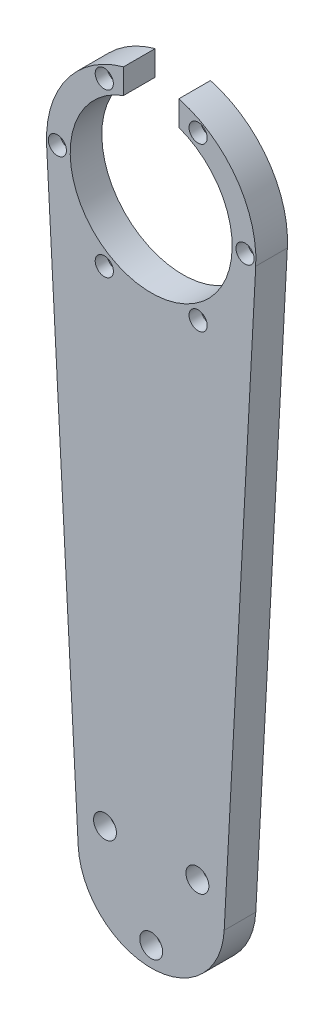
ISO-10303-21;
HEADER;
FILE_DESCRIPTION(('STEP AP214'),'2;1');
FILE_NAME('part.step','',(''),(''),'','','');
FILE_SCHEMA(('AUTOMOTIVE_DESIGN { 1 0 10303 214 1 1 1 1 }'));
ENDSEC;
DATA;
#1=APPLICATION_CONTEXT('core data for automotive mechanical design processes');
#2=APPLICATION_PROTOCOL_DEFINITION('international standard','automotive_design',2000,#1);
#3=PRODUCT_CONTEXT('',#1,'mechanical');
#4=PRODUCT('Part','Part','',(#3));
#5=PRODUCT_RELATED_PRODUCT_CATEGORY('part','',(#4));
#6=PRODUCT_DEFINITION_FORMATION('','',#4);
#7=PRODUCT_DEFINITION_CONTEXT('part definition',#1,'design');
#8=PRODUCT_DEFINITION('design','',#6,#7);
#9=PRODUCT_DEFINITION_SHAPE('','',#8);
#10=(LENGTH_UNIT() NAMED_UNIT(*) SI_UNIT(.MILLI.,.METRE.));
#11=(NAMED_UNIT(*) PLANE_ANGLE_UNIT() SI_UNIT($,.RADIAN.));
#12=(NAMED_UNIT(*) SI_UNIT($,.STERADIAN.) SOLID_ANGLE_UNIT());
#13=UNCERTAINTY_MEASURE_WITH_UNIT(LENGTH_MEASURE(1.E-05),#10,'distance_accuracy_value','');
#14=(GEOMETRIC_REPRESENTATION_CONTEXT(3) GLOBAL_UNCERTAINTY_ASSIGNED_CONTEXT((#13)) GLOBAL_UNIT_ASSIGNED_CONTEXT((#10,
#11,#12)) REPRESENTATION_CONTEXT('',''));
#15=CARTESIAN_POINT('',(0.,0.,0.));
#16=DIRECTION('',(0.,0.,1.));
#17=DIRECTION('',(1.,0.,0.));
#18=AXIS2_PLACEMENT_3D('',#15,#16,#17);
#19=CARTESIAN_POINT('',(11.8749999999999,129.43189666012,-2.));
#20=DIRECTION('',(0.,0.,1.));
#21=DIRECTION('',(1.,0.,0.));
#22=AXIS2_PLACEMENT_3D('',#19,#20,#21);
#23=CYLINDRICAL_SURFACE('',#22,1.25);
#24=CARTESIAN_POINT('',(11.8749999999999,129.43189666012,0.));
#25=DIRECTION('',(0.,0.,1.));
#26=DIRECTION('',(1.,0.,0.));
#27=AXIS2_PLACEMENT_3D('',#24,#25,#26);
#28=CIRCLE('',#27,1.25);
#29=CARTESIAN_POINT('',(13.1249999999999,129.43189666012,0.));
#30=VERTEX_POINT('',#29);
#31=EDGE_CURVE('E165',#30,#30,#28,.T.);
#32=ORIENTED_EDGE('',*,*,#31,.F.);
#33=EDGE_LOOP('',(#32));
#34=FACE_BOUND('',#33,.T.);
#35=CARTESIAN_POINT('',(11.8749999999999,129.43189666012,5.));
#36=DIRECTION('',(0.,0.,1.));
#37=DIRECTION('',(1.,0.,0.));
#38=AXIS2_PLACEMENT_3D('',#35,#36,#37);
#39=CIRCLE('',#38,1.25);
#40=CARTESIAN_POINT('',(13.1249999999999,129.43189666012,5.));
#41=VERTEX_POINT('',#40);
#42=EDGE_CURVE('E43',#41,#41,#39,.F.);
#43=ORIENTED_EDGE('',*,*,#42,.F.);
#44=EDGE_LOOP('',(#43));
#45=FACE_BOUND('',#44,.T.);
#46=ADVANCED_FACE('F39',(#34,#45),#23,.F.);
#47=CARTESIAN_POINT('',(-11.8750000000001,129.43189666012,-2.));
#48=DIRECTION('',(0.,0.,1.));
#49=DIRECTION('',(1.,0.,0.));
#50=AXIS2_PLACEMENT_3D('',#47,#48,#49);
#51=CYLINDRICAL_SURFACE('',#50,1.25000000000002);
#52=CARTESIAN_POINT('',(-11.8750000000001,129.43189666012,0.));
#53=DIRECTION('',(0.,0.,1.));
#54=DIRECTION('',(1.,0.,0.));
#55=AXIS2_PLACEMENT_3D('',#52,#53,#54);
#56=CIRCLE('',#55,1.25000000000002);
#57=CARTESIAN_POINT('',(-10.6250000000001,129.43189666012,0.));
#58=VERTEX_POINT('',#57);
#59=EDGE_CURVE('E168',#58,#58,#56,.T.);
#60=ORIENTED_EDGE('',*,*,#59,.F.);
#61=EDGE_LOOP('',(#60));
#62=FACE_BOUND('',#61,.T.);
#63=CARTESIAN_POINT('',(-11.8750000000001,129.43189666012,5.));
#64=DIRECTION('',(0.,0.,1.));
#65=DIRECTION('',(1.,0.,0.));
#66=AXIS2_PLACEMENT_3D('',#63,#64,#65);
#67=CIRCLE('',#66,1.25000000000002);
#68=CARTESIAN_POINT('',(-10.6250000000001,129.43189666012,5.));
#69=VERTEX_POINT('',#68);
#70=EDGE_CURVE('E206',#69,#69,#67,.F.);
#71=ORIENTED_EDGE('',*,*,#70,.F.);
#72=EDGE_LOOP('',(#71));
#73=FACE_BOUND('',#72,.T.);
#74=ADVANCED_FACE('F266',(#62,#73),#51,.F.);
#75=CARTESIAN_POINT('',(-23.75,150.,-2.));
#76=DIRECTION('',(0.,0.,1.));
#77=DIRECTION('',(1.,0.,0.));
#78=AXIS2_PLACEMENT_3D('',#75,#76,#77);
#79=CYLINDRICAL_SURFACE('',#78,1.25);
#80=CARTESIAN_POINT('',(-23.75,150.,0.));
#81=DIRECTION('',(0.,0.,1.));
#82=DIRECTION('',(1.,0.,0.));
#83=AXIS2_PLACEMENT_3D('',#80,#81,#82);
#84=CIRCLE('',#83,1.25);
#85=CARTESIAN_POINT('',(-22.5,150.,0.));
#86=VERTEX_POINT('',#85);
#87=EDGE_CURVE('E172',#86,#86,#84,.T.);
#88=ORIENTED_EDGE('',*,*,#87,.F.);
#89=EDGE_LOOP('',(#88));
#90=FACE_BOUND('',#89,.T.);
#91=CARTESIAN_POINT('',(-23.75,150.,5.));
#92=DIRECTION('',(0.,0.,1.));
#93=DIRECTION('',(1.,0.,0.));
#94=AXIS2_PLACEMENT_3D('',#91,#92,#93);
#95=CIRCLE('',#94,1.25);
#96=CARTESIAN_POINT('',(-22.5,150.,5.));
#97=VERTEX_POINT('',#96);
#98=EDGE_CURVE('E204',#97,#97,#95,.F.);
#99=ORIENTED_EDGE('',*,*,#98,.F.);
#100=EDGE_LOOP('',(#99));
#101=FACE_BOUND('',#100,.T.);
#102=ADVANCED_FACE('F273',(#90,#101),#79,.F.);
#103=CARTESIAN_POINT('',(-11.8749999999998,170.568103339881,-2.));
#104=DIRECTION('',(0.,0.,1.));
#105=DIRECTION('',(1.,0.,0.));
#106=AXIS2_PLACEMENT_3D('',#103,#104,#105);
#107=CYLINDRICAL_SURFACE('',#106,1.25);
#108=CARTESIAN_POINT('',(-11.8749999999998,170.568103339881,0.));
#109=DIRECTION('',(0.,0.,1.));
#110=DIRECTION('',(1.,0.,0.));
#111=AXIS2_PLACEMENT_3D('',#108,#109,#110);
#112=CIRCLE('',#111,1.25);
#113=CARTESIAN_POINT('',(-10.6249999999998,170.568103339881,0.));
#114=VERTEX_POINT('',#113);
#115=EDGE_CURVE('E175',#114,#114,#112,.T.);
#116=ORIENTED_EDGE('',*,*,#115,.F.);
#117=EDGE_LOOP('',(#116));
#118=FACE_BOUND('',#117,.T.);
#119=CARTESIAN_POINT('',(-11.8749999999998,170.568103339881,5.));
#120=DIRECTION('',(0.,0.,1.));
#121=DIRECTION('',(1.,0.,0.));
#122=AXIS2_PLACEMENT_3D('',#119,#120,#121);
#123=CIRCLE('',#122,1.25);
#124=CARTESIAN_POINT('',(-10.6249999999998,170.568103339881,5.));
#125=VERTEX_POINT('',#124);
#126=EDGE_CURVE('E201',#125,#125,#123,.F.);
#127=ORIENTED_EDGE('',*,*,#126,.F.);
#128=EDGE_LOOP('',(#127));
#129=FACE_BOUND('',#128,.T.);
#130=ADVANCED_FACE('F284',(#118,#129),#107,.F.);
#131=CARTESIAN_POINT('',(11.8750000000002,170.56810333988,-2.));
#132=DIRECTION('',(0.,0.,1.));
#133=DIRECTION('',(1.,0.,0.));
#134=AXIS2_PLACEMENT_3D('',#131,#132,#133);
#135=CYLINDRICAL_SURFACE('',#134,1.25000000000002);
#136=CARTESIAN_POINT('',(11.8750000000002,170.56810333988,0.));
#137=DIRECTION('',(0.,0.,1.));
#138=DIRECTION('',(1.,0.,0.));
#139=AXIS2_PLACEMENT_3D('',#136,#137,#138);
#140=CIRCLE('',#139,1.25000000000002);
#141=CARTESIAN_POINT('',(13.1250000000003,170.56810333988,0.));
#142=VERTEX_POINT('',#141);
#143=EDGE_CURVE('E178',#142,#142,#140,.T.);
#144=ORIENTED_EDGE('',*,*,#143,.F.);
#145=EDGE_LOOP('',(#144));
#146=FACE_BOUND('',#145,.T.);
#147=CARTESIAN_POINT('',(11.8750000000002,170.56810333988,5.));
#148=DIRECTION('',(0.,0.,1.));
#149=DIRECTION('',(1.,0.,0.));
#150=AXIS2_PLACEMENT_3D('',#147,#148,#149);
#151=CIRCLE('',#150,1.25000000000002);
#152=CARTESIAN_POINT('',(13.1250000000003,170.56810333988,5.));
#153=VERTEX_POINT('',#152);
#154=EDGE_CURVE('E197',#153,#153,#151,.F.);
#155=ORIENTED_EDGE('',*,*,#154,.F.);
#156=EDGE_LOOP('',(#155));
#157=FACE_BOUND('',#156,.T.);
#158=ADVANCED_FACE('F279',(#146,#157),#135,.F.);
#159=CARTESIAN_POINT('',(23.75,150.,-2.));
#160=DIRECTION('',(0.,0.,1.));
#161=DIRECTION('',(1.,0.,0.));
#162=AXIS2_PLACEMENT_3D('',#159,#160,#161);
#163=CYLINDRICAL_SURFACE('',#162,1.25);
#164=CARTESIAN_POINT('',(23.75,150.,0.));
#165=DIRECTION('',(0.,0.,1.));
#166=DIRECTION('',(1.,0.,0.));
#167=AXIS2_PLACEMENT_3D('',#164,#165,#166);
#168=CIRCLE('',#167,1.25);
#169=CARTESIAN_POINT('',(25.,150.,0.));
#170=VERTEX_POINT('',#169);
#171=EDGE_CURVE('E181',#170,#170,#168,.T.);
#172=ORIENTED_EDGE('',*,*,#171,.F.);
#173=EDGE_LOOP('',(#172));
#174=FACE_BOUND('',#173,.T.);
#175=CARTESIAN_POINT('',(23.75,150.,5.));
#176=DIRECTION('',(0.,0.,1.));
#177=DIRECTION('',(1.,0.,0.));
#178=AXIS2_PLACEMENT_3D('',#175,#176,#177);
#179=CIRCLE('',#178,1.25);
#180=CARTESIAN_POINT('',(25.,150.,5.));
#181=VERTEX_POINT('',#180);
#182=EDGE_CURVE('E194',#181,#181,#179,.F.);
#183=ORIENTED_EDGE('',*,*,#182,.F.);
#184=EDGE_LOOP('',(#183));
#185=FACE_BOUND('',#184,.T.);
#186=ADVANCED_FACE('F299',(#174,#185),#163,.F.);
#187=CARTESIAN_POINT('',(11.69134295109,6.74999999999989,0.));
#188=DIRECTION('',(0.,0.,1.));
#189=DIRECTION('',(1.,0.,0.));
#190=AXIS2_PLACEMENT_3D('',#187,#188,#189);
#191=CYLINDRICAL_SURFACE('',#190,1.6);
#192=CARTESIAN_POINT('',(11.69134295109,6.74999999999989,0.));
#193=DIRECTION('',(0.,0.,1.));
#194=DIRECTION('',(1.,0.,0.));
#195=AXIS2_PLACEMENT_3D('',#192,#193,#194);
#196=CIRCLE('',#195,1.6);
#197=CARTESIAN_POINT('',(13.29134295109,6.74999999999989,0.));
#198=VERTEX_POINT('',#197);
#199=EDGE_CURVE('E184',#198,#198,#196,.T.);
#200=ORIENTED_EDGE('',*,*,#199,.F.);
#201=EDGE_LOOP('',(#200));
#202=FACE_BOUND('',#201,.T.);
#203=CARTESIAN_POINT('',(11.69134295109,6.74999999999989,4.));
#204=DIRECTION('',(0.,0.,1.));
#205=DIRECTION('',(1.,0.,0.));
#206=AXIS2_PLACEMENT_3D('',#203,#204,#205);
#207=CIRCLE('',#206,1.6);
#208=CARTESIAN_POINT('',(13.29134295109,6.74999999999989,4.));
#209=VERTEX_POINT('',#208);
#210=EDGE_CURVE('E169',#209,#209,#207,.F.);
#211=ORIENTED_EDGE('',*,*,#210,.F.);
#212=EDGE_LOOP('',(#211));
#213=FACE_BOUND('',#212,.T.);
#214=ADVANCED_FACE('F296',(#202,#213),#191,.F.);
#215=CARTESIAN_POINT('',(-11.6913429510899,6.75000000000005,0.));
#216=DIRECTION('',(0.,0.,1.));
#217=DIRECTION('',(1.,0.,0.));
#218=AXIS2_PLACEMENT_3D('',#215,#216,#217);
#219=CYLINDRICAL_SURFACE('',#218,1.6);
#220=CARTESIAN_POINT('',(-11.6913429510899,6.75000000000005,0.));
#221=DIRECTION('',(0.,0.,1.));
#222=DIRECTION('',(1.,0.,0.));
#223=AXIS2_PLACEMENT_3D('',#220,#221,#222);
#224=CIRCLE('',#223,1.6);
#225=CARTESIAN_POINT('',(-10.0913429510899,6.75000000000005,0.));
#226=VERTEX_POINT('',#225);
#227=EDGE_CURVE('E226',#226,#226,#224,.T.);
#228=ORIENTED_EDGE('',*,*,#227,.F.);
#229=EDGE_LOOP('',(#228));
#230=FACE_BOUND('',#229,.T.);
#231=CARTESIAN_POINT('',(-11.6913429510899,6.75000000000005,4.));
#232=DIRECTION('',(0.,0.,1.));
#233=DIRECTION('',(1.,0.,0.));
#234=AXIS2_PLACEMENT_3D('',#231,#232,#233);
#235=CIRCLE('',#234,1.6);
#236=CARTESIAN_POINT('',(-10.0913429510899,6.75000000000005,4.));
#237=VERTEX_POINT('',#236);
#238=EDGE_CURVE('E188',#237,#237,#235,.F.);
#239=ORIENTED_EDGE('',*,*,#238,.F.);
#240=EDGE_LOOP('',(#239));
#241=FACE_BOUND('',#240,.T.);
#242=ADVANCED_FACE('F292',(#230,#241),#219,.F.);
#243=CARTESIAN_POINT('',(0.,-13.5,0.));
#244=DIRECTION('',(0.,0.,1.));
#245=DIRECTION('',(1.,0.,0.));
#246=AXIS2_PLACEMENT_3D('',#243,#244,#245);
#247=CYLINDRICAL_SURFACE('',#246,1.6);
#248=CARTESIAN_POINT('',(0.,-13.5,0.));
#249=DIRECTION('',(0.,0.,1.));
#250=DIRECTION('',(1.,0.,0.));
#251=AXIS2_PLACEMENT_3D('',#248,#249,#250);
#252=CIRCLE('',#251,1.6);
#253=CARTESIAN_POINT('',(1.6,-13.5,0.));
#254=VERTEX_POINT('',#253);
#255=EDGE_CURVE('E142',#254,#254,#252,.T.);
#256=ORIENTED_EDGE('',*,*,#255,.F.);
#257=EDGE_LOOP('',(#256));
#258=FACE_BOUND('',#257,.T.);
#259=CARTESIAN_POINT('',(0.,-13.5,4.));
#260=DIRECTION('',(0.,0.,1.));
#261=DIRECTION('',(1.,0.,0.));
#262=AXIS2_PLACEMENT_3D('',#259,#260,#261);
#263=CIRCLE('',#262,1.6);
#264=CARTESIAN_POINT('',(1.6,-13.5,4.));
#265=VERTEX_POINT('',#264);
#266=EDGE_CURVE('E185',#265,#265,#263,.F.);
#267=ORIENTED_EDGE('',*,*,#266,.F.);
#268=EDGE_LOOP('',(#267));
#269=FACE_BOUND('',#268,.T.);
#270=ADVANCED_FACE('F289',(#258,#269),#247,.F.);
#271=CARTESIAN_POINT('',(0.,150.,8.));
#272=DIRECTION('',(0.,0.,-1.));
#273=DIRECTION('',(-1.,0.,0.));
#274=AXIS2_PLACEMENT_3D('',#271,#272,#273);
#275=CYLINDRICAL_SURFACE('',#274,20.5);
#276=CARTESIAN_POINT('',(0.,150.,0.));
#277=DIRECTION('',(0.,0.,-1.));
#278=DIRECTION('',(1.,0.,0.));
#279=AXIS2_PLACEMENT_3D('',#276,#277,#278);
#280=CIRCLE('',#279,20.5);
#281=CARTESIAN_POINT('',(7.00000000000001,169.267848867998,0.));
#282=VERTEX_POINT('',#281);
#283=CARTESIAN_POINT('',(-6.99999999999999,169.267848867998,0.));
#284=VERTEX_POINT('',#283);
#285=EDGE_CURVE('E138',#282,#284,#280,.T.);
#286=ORIENTED_EDGE('',*,*,#285,.T.);
#287=DIRECTION('',(0.,0.,-1.));
#288=VECTOR('',#287,1.);
#289=CARTESIAN_POINT('',(-6.99999999999999,169.267848867998,8.));
#290=LINE('',#289,#288);
#291=CARTESIAN_POINT('',(-6.99999999999999,169.267848867998,8.));
#292=VERTEX_POINT('',#291);
#293=EDGE_CURVE('E11',#292,#284,#290,.T.);
#294=ORIENTED_EDGE('',*,*,#293,.F.);
#295=CARTESIAN_POINT('',(0.,150.,8.));
#296=DIRECTION('',(0.,0.,-1.));
#297=DIRECTION('',(1.,0.,0.));
#298=AXIS2_PLACEMENT_3D('',#295,#296,#297);
#299=CIRCLE('',#298,20.5);
#300=CARTESIAN_POINT('',(7.00000000000001,169.267848867998,8.));
#301=VERTEX_POINT('',#300);
#302=EDGE_CURVE('E153',#301,#292,#299,.T.);
#303=ORIENTED_EDGE('',*,*,#302,.F.);
#304=DIRECTION('',(0.,0.,-1.));
#305=VECTOR('',#304,1.);
#306=CARTESIAN_POINT('',(7.00000000000001,169.267848867998,8.));
#307=LINE('',#306,#305);
#308=EDGE_CURVE('E134',#301,#282,#307,.T.);
#309=ORIENTED_EDGE('',*,*,#308,.T.);
#310=EDGE_LOOP('',(#286,#294,#303,#309));
#311=FACE_BOUND('',#310,.T.);
#312=ADVANCED_FACE('F41',(#311),#275,.F.);
#313=CARTESIAN_POINT('',(-7.,175.558755838264,8.));
#314=DIRECTION('',(-1.,0.,0.));
#315=DIRECTION('',(0.,-1.,0.));
#316=AXIS2_PLACEMENT_3D('',#313,#314,#315);
#317=PLANE('',#316);
#318=DIRECTION('',(0.,1.,0.));
#319=VECTOR('',#318,1.);
#320=CARTESIAN_POINT('',(-7.,175.558755838264,0.));
#321=LINE('',#320,#319);
#322=CARTESIAN_POINT('',(-6.99999999999999,175.558755838264,0.));
#323=VERTEX_POINT('',#322);
#324=EDGE_CURVE('E141',#284,#323,#321,.T.);
#325=ORIENTED_EDGE('',*,*,#324,.T.);
#326=DIRECTION('',(0.,0.,-1.));
#327=VECTOR('',#326,1.);
#328=CARTESIAN_POINT('',(-6.99999999999999,175.558755838264,8.));
#329=LINE('',#328,#327);
#330=CARTESIAN_POINT('',(-6.99999999999999,175.558755838264,8.));
#331=VERTEX_POINT('',#330);
#332=EDGE_CURVE('E49',#331,#323,#329,.T.);
#333=ORIENTED_EDGE('',*,*,#332,.F.);
#334=DIRECTION('',(0.,1.,0.));
#335=VECTOR('',#334,1.);
#336=CARTESIAN_POINT('',(-7.,175.558755838264,8.));
#337=LINE('',#336,#335);
#338=EDGE_CURVE('E101',#292,#331,#337,.T.);
#339=ORIENTED_EDGE('',*,*,#338,.F.);
#340=ORIENTED_EDGE('',*,*,#293,.T.);
#341=EDGE_LOOP('',(#325,#333,#339,#340));
#342=FACE_BOUND('',#341,.T.);
#343=ADVANCED_FACE('F694',(#342),#317,.F.);
#344=CARTESIAN_POINT('',(0.,150.,8.));
#345=DIRECTION('',(0.,0.,-1.));
#346=DIRECTION('',(-1.,0.,0.));
#347=AXIS2_PLACEMENT_3D('',#344,#345,#346);
#348=CYLINDRICAL_SURFACE('',#347,26.5);
#349=CARTESIAN_POINT('',(0.,150.,0.));
#350=DIRECTION('',(0.,0.,1.));
#351=DIRECTION('',(1.,0.,0.));
#352=AXIS2_PLACEMENT_3D('',#349,#350,#351);
#353=CIRCLE('',#352,26.5);
#354=CARTESIAN_POINT('',(-26.4622842719386,148.586666666667,0.));
#355=VERTEX_POINT('',#354);
#356=EDGE_CURVE('E144',#323,#355,#353,.T.);
#357=ORIENTED_EDGE('',*,*,#356,.T.);
#358=DIRECTION('',(0.,0.,-1.));
#359=VECTOR('',#358,1.);
#360=CARTESIAN_POINT('',(-26.4622842719386,148.586666666667,8.));
#361=LINE('',#360,#359);
#362=CARTESIAN_POINT('',(-26.4622842719386,148.586666666667,8.));
#363=VERTEX_POINT('',#362);
#364=EDGE_CURVE('E160',#363,#355,#361,.T.);
#365=ORIENTED_EDGE('',*,*,#364,.F.);
#366=CARTESIAN_POINT('',(0.,150.,8.));
#367=DIRECTION('',(0.,0.,1.));
#368=DIRECTION('',(1.,0.,0.));
#369=AXIS2_PLACEMENT_3D('',#366,#367,#368);
#370=CIRCLE('',#369,26.5);
#371=EDGE_CURVE('E233',#331,#363,#370,.T.);
#372=ORIENTED_EDGE('',*,*,#371,.F.);
#373=ORIENTED_EDGE('',*,*,#332,.T.);
#374=EDGE_LOOP('',(#357,#365,#372,#373));
#375=FACE_BOUND('',#374,.T.);
#376=ADVANCED_FACE('F686',(#375),#348,.T.);
#377=CARTESIAN_POINT('',(-26.4622842719386,148.586666666667,8.));
#378=DIRECTION('',(0.998576764978815,0.0533333333333333,0.));
#379=DIRECTION('',(-0.0533333333333333,0.998576764978815,0.));
#380=AXIS2_PLACEMENT_3D('',#377,#378,#379);
#381=PLANE('',#380);
#382=DIRECTION('',(0.0533333333333333,-0.998576764978815,0.));
#383=VECTOR('',#382,1.);
#384=CARTESIAN_POINT('',(-26.4622842719386,148.586666666667,0.));
#385=LINE('',#384,#383);
#386=CARTESIAN_POINT('',(-18.4736701521081,-0.986666666666666,0.));
#387=VERTEX_POINT('',#386);
#388=EDGE_CURVE('E146',#355,#387,#385,.T.);
#389=ORIENTED_EDGE('',*,*,#388,.T.);
#390=DIRECTION('',(0.,0.,-1.));
#391=VECTOR('',#390,1.);
#392=CARTESIAN_POINT('',(-18.4736701521081,-0.986666666666666,8.));
#393=LINE('',#392,#391);
#394=CARTESIAN_POINT('',(-18.4736701521081,-0.986666666666666,8.));
#395=VERTEX_POINT('',#394);
#396=EDGE_CURVE('E157',#395,#387,#393,.T.);
#397=ORIENTED_EDGE('',*,*,#396,.F.);
#398=DIRECTION('',(0.0533333333333333,-0.998576764978815,0.));
#399=VECTOR('',#398,1.);
#400=CARTESIAN_POINT('',(-26.4622842719386,148.586666666667,8.));
#401=LINE('',#400,#399);
#402=EDGE_CURVE('E235',#363,#395,#401,.T.);
#403=ORIENTED_EDGE('',*,*,#402,.F.);
#404=ORIENTED_EDGE('',*,*,#364,.T.);
#405=EDGE_LOOP('',(#389,#397,#403,#404));
#406=FACE_BOUND('',#405,.T.);
#407=ADVANCED_FACE('F241',(#406),#381,.F.);
#408=CARTESIAN_POINT('',(0.,0.,8.));
#409=DIRECTION('',(0.,0.,-1.));
#410=DIRECTION('',(-1.,0.,0.));
#411=AXIS2_PLACEMENT_3D('',#408,#409,#410);
#412=CYLINDRICAL_SURFACE('',#411,18.5);
#413=CARTESIAN_POINT('',(0.,0.,0.));
#414=DIRECTION('',(0.,0.,1.));
#415=DIRECTION('',(1.,0.,0.));
#416=AXIS2_PLACEMENT_3D('',#413,#414,#415);
#417=CIRCLE('',#416,18.5);
#418=CARTESIAN_POINT('',(18.4736701521081,-0.986666666666666,0.));
#419=VERTEX_POINT('',#418);
#420=EDGE_CURVE('E148',#387,#419,#417,.T.);
#421=ORIENTED_EDGE('',*,*,#420,.T.);
#422=DIRECTION('',(0.,0.,-1.));
#423=VECTOR('',#422,1.);
#424=CARTESIAN_POINT('',(18.4736701521081,-0.986666666666666,8.));
#425=LINE('',#424,#423);
#426=CARTESIAN_POINT('',(18.4736701521081,-0.986666666666666,8.));
#427=VERTEX_POINT('',#426);
#428=EDGE_CURVE('E129',#427,#419,#425,.T.);
#429=ORIENTED_EDGE('',*,*,#428,.F.);
#430=CARTESIAN_POINT('',(0.,0.,8.));
#431=DIRECTION('',(0.,0.,1.));
#432=DIRECTION('',(1.,0.,0.));
#433=AXIS2_PLACEMENT_3D('',#430,#431,#432);
#434=CIRCLE('',#433,18.5);
#435=EDGE_CURVE('E120',#395,#427,#434,.T.);
#436=ORIENTED_EDGE('',*,*,#435,.F.);
#437=ORIENTED_EDGE('',*,*,#396,.T.);
#438=EDGE_LOOP('',(#421,#429,#436,#437));
#439=FACE_BOUND('',#438,.T.);
#440=ADVANCED_FACE('F245',(#439),#412,.T.);
#441=CARTESIAN_POINT('',(26.4622842719386,148.586666666667,8.));
#442=DIRECTION('',(-0.998576764978815,0.0533333333333332,0.));
#443=DIRECTION('',(-0.0533333333333332,-0.998576764978815,0.));
#444=AXIS2_PLACEMENT_3D('',#441,#442,#443);
#445=PLANE('',#444);
#446=DIRECTION('',(0.0533333333333332,0.998576764978815,0.));
#447=VECTOR('',#446,1.);
#448=CARTESIAN_POINT('',(26.4622842719386,148.586666666667,0.));
#449=LINE('',#448,#447);
#450=CARTESIAN_POINT('',(26.4622842719386,148.586666666667,0.));
#451=VERTEX_POINT('',#450);
#452=EDGE_CURVE('E128',#419,#451,#449,.T.);
#453=ORIENTED_EDGE('',*,*,#452,.T.);
#454=DIRECTION('',(0.,0.,-1.));
#455=VECTOR('',#454,1.);
#456=CARTESIAN_POINT('',(26.4622842719386,148.586666666667,8.));
#457=LINE('',#456,#455);
#458=CARTESIAN_POINT('',(26.4622842719386,148.586666666667,8.));
#459=VERTEX_POINT('',#458);
#460=EDGE_CURVE('E125',#459,#451,#457,.T.);
#461=ORIENTED_EDGE('',*,*,#460,.F.);
#462=DIRECTION('',(0.0533333333333332,0.998576764978815,0.));
#463=VECTOR('',#462,1.);
#464=CARTESIAN_POINT('',(26.4622842719386,148.586666666667,8.));
#465=LINE('',#464,#463);
#466=EDGE_CURVE('E114',#427,#459,#465,.T.);
#467=ORIENTED_EDGE('',*,*,#466,.F.);
#468=ORIENTED_EDGE('',*,*,#428,.T.);
#469=EDGE_LOOP('',(#453,#461,#467,#468));
#470=FACE_BOUND('',#469,.T.);
#471=ADVANCED_FACE('F126',(#470),#445,.F.);
#472=CARTESIAN_POINT('',(0.,150.,8.));
#473=DIRECTION('',(0.,0.,-1.));
#474=DIRECTION('',(-1.,0.,0.));
#475=AXIS2_PLACEMENT_3D('',#472,#473,#474);
#476=CYLINDRICAL_SURFACE('',#475,26.5);
#477=CARTESIAN_POINT('',(0.,150.,0.));
#478=DIRECTION('',(0.,0.,1.));
#479=DIRECTION('',(1.,0.,0.));
#480=AXIS2_PLACEMENT_3D('',#477,#478,#479);
#481=CIRCLE('',#480,26.5);
#482=CARTESIAN_POINT('',(7.,175.558755838264,0.));
#483=VERTEX_POINT('',#482);
#484=EDGE_CURVE('E87',#451,#483,#481,.T.);
#485=ORIENTED_EDGE('',*,*,#484,.T.);
#486=DIRECTION('',(0.,0.,-1.));
#487=VECTOR('',#486,1.);
#488=CARTESIAN_POINT('',(7.,175.558755838264,8.));
#489=LINE('',#488,#487);
#490=CARTESIAN_POINT('',(7.,175.558755838264,8.));
#491=VERTEX_POINT('',#490);
#492=EDGE_CURVE('E130',#491,#483,#489,.T.);
#493=ORIENTED_EDGE('',*,*,#492,.F.);
#494=CARTESIAN_POINT('',(0.,150.,8.));
#495=DIRECTION('',(0.,0.,1.));
#496=DIRECTION('',(1.,0.,0.));
#497=AXIS2_PLACEMENT_3D('',#494,#495,#496);
#498=CIRCLE('',#497,26.5);
#499=EDGE_CURVE('E118',#459,#491,#498,.T.);
#500=ORIENTED_EDGE('',*,*,#499,.F.);
#501=ORIENTED_EDGE('',*,*,#460,.T.);
#502=EDGE_LOOP('',(#485,#493,#500,#501));
#503=FACE_BOUND('',#502,.T.);
#504=ADVANCED_FACE('F132',(#503),#476,.T.);
#505=CARTESIAN_POINT('',(7.,175.558755838264,8.));
#506=DIRECTION('',(1.,0.,0.));
#507=DIRECTION('',(0.,1.,0.));
#508=AXIS2_PLACEMENT_3D('',#505,#506,#507);
#509=PLANE('',#508);
#510=DIRECTION('',(0.,-1.,0.));
#511=VECTOR('',#510,1.);
#512=CARTESIAN_POINT('',(7.,175.558755838264,0.));
#513=LINE('',#512,#511);
#514=EDGE_CURVE('E93',#483,#282,#513,.T.);
#515=ORIENTED_EDGE('',*,*,#514,.T.);
#516=ORIENTED_EDGE('',*,*,#308,.F.);
#517=DIRECTION('',(0.,-1.,0.));
#518=VECTOR('',#517,1.);
#519=CARTESIAN_POINT('',(7.,175.558755838264,8.));
#520=LINE('',#519,#518);
#521=EDGE_CURVE('E58',#491,#301,#520,.T.);
#522=ORIENTED_EDGE('',*,*,#521,.F.);
#523=ORIENTED_EDGE('',*,*,#492,.T.);
#524=EDGE_LOOP('',(#515,#516,#522,#523));
#525=FACE_BOUND('',#524,.T.);
#526=ADVANCED_FACE('F253',(#525),#509,.F.);
#527=CARTESIAN_POINT('',(0.,150.,8.));
#528=DIRECTION('',(0.,0.,1.));
#529=DIRECTION('',(1.,0.,0.));
#530=AXIS2_PLACEMENT_3D('',#527,#528,#529);
#531=PLANE('',#530);
#532=CARTESIAN_POINT('',(23.75,150.,8.));
#533=DIRECTION('',(0.,0.,1.));
#534=DIRECTION('',(1.,0.,0.));
#535=AXIS2_PLACEMENT_3D('',#532,#533,#534);
#536=CIRCLE('',#535,2.3);
#537=CARTESIAN_POINT('',(26.05,150.,8.));
#538=VERTEX_POINT('',#537);
#539=EDGE_CURVE('E455',#538,#538,#536,.T.);
#540=ORIENTED_EDGE('',*,*,#539,.F.);
#541=EDGE_LOOP('',(#540));
#542=FACE_BOUND('',#541,.T.);
#543=CARTESIAN_POINT('',(11.8750000000002,170.56810333988,8.));
#544=DIRECTION('',(0.,0.,1.));
#545=DIRECTION('',(1.,0.,0.));
#546=AXIS2_PLACEMENT_3D('',#543,#544,#545);
#547=CIRCLE('',#546,2.3);
#548=CARTESIAN_POINT('',(14.1750000000002,170.56810333988,8.));
#549=VERTEX_POINT('',#548);
#550=EDGE_CURVE('E434',#549,#549,#547,.T.);
#551=ORIENTED_EDGE('',*,*,#550,.F.);
#552=EDGE_LOOP('',(#551));
#553=FACE_BOUND('',#552,.T.);
#554=CARTESIAN_POINT('',(-11.8749999999998,170.568103339881,8.));
#555=DIRECTION('',(0.,0.,1.));
#556=DIRECTION('',(1.,0.,0.));
#557=AXIS2_PLACEMENT_3D('',#554,#555,#556);
#558=CIRCLE('',#557,2.3);
#559=CARTESIAN_POINT('',(-9.5749999999998,170.568103339881,8.));
#560=VERTEX_POINT('',#559);
#561=EDGE_CURVE('E433',#560,#560,#558,.T.);
#562=ORIENTED_EDGE('',*,*,#561,.F.);
#563=EDGE_LOOP('',(#562));
#564=FACE_BOUND('',#563,.T.);
#565=CARTESIAN_POINT('',(-23.75,150.,8.));
#566=DIRECTION('',(0.,0.,1.));
#567=DIRECTION('',(1.,0.,0.));
#568=AXIS2_PLACEMENT_3D('',#565,#566,#567);
#569=CIRCLE('',#568,2.3);
#570=CARTESIAN_POINT('',(-21.45,150.,8.));
#571=VERTEX_POINT('',#570);
#572=EDGE_CURVE('E440',#571,#571,#569,.T.);
#573=ORIENTED_EDGE('',*,*,#572,.F.);
#574=EDGE_LOOP('',(#573));
#575=FACE_BOUND('',#574,.T.);
#576=CARTESIAN_POINT('',(-11.8750000000001,129.43189666012,8.));
#577=DIRECTION('',(0.,0.,1.));
#578=DIRECTION('',(1.,0.,0.));
#579=AXIS2_PLACEMENT_3D('',#576,#577,#578);
#580=CIRCLE('',#579,2.3);
#581=CARTESIAN_POINT('',(-9.5750000000001,129.43189666012,8.));
#582=VERTEX_POINT('',#581);
#583=EDGE_CURVE('E446',#582,#582,#580,.T.);
#584=ORIENTED_EDGE('',*,*,#583,.F.);
#585=EDGE_LOOP('',(#584));
#586=FACE_BOUND('',#585,.T.);
#587=CARTESIAN_POINT('',(11.8749999999999,129.43189666012,8.));
#588=DIRECTION('',(0.,0.,1.));
#589=DIRECTION('',(1.,0.,0.));
#590=AXIS2_PLACEMENT_3D('',#587,#588,#589);
#591=CIRCLE('',#590,2.3);
#592=CARTESIAN_POINT('',(14.1749999999999,129.43189666012,8.));
#593=VERTEX_POINT('',#592);
#594=EDGE_CURVE('E452',#593,#593,#591,.T.);
#595=ORIENTED_EDGE('',*,*,#594,.F.);
#596=EDGE_LOOP('',(#595));
#597=FACE_BOUND('',#596,.T.);
#598=CARTESIAN_POINT('',(-11.6913429510899,6.75000000000005,8.));
#599=DIRECTION('',(0.,0.,1.));
#600=DIRECTION('',(1.,0.,0.));
#601=AXIS2_PLACEMENT_3D('',#598,#599,#600);
#602=CIRCLE('',#601,2.9);
#603=CARTESIAN_POINT('',(-8.79134295108989,6.75000000000005,8.));
#604=VERTEX_POINT('',#603);
#605=EDGE_CURVE('E415',#604,#604,#602,.T.);
#606=ORIENTED_EDGE('',*,*,#605,.F.);
#607=EDGE_LOOP('',(#606));
#608=FACE_BOUND('',#607,.T.);
#609=CARTESIAN_POINT('',(11.69134295109,6.74999999999989,8.));
#610=DIRECTION('',(0.,0.,1.));
#611=DIRECTION('',(1.,0.,0.));
#612=AXIS2_PLACEMENT_3D('',#609,#610,#611);
#613=CIRCLE('',#612,2.9);
#614=CARTESIAN_POINT('',(14.59134295109,6.74999999999989,8.));
#615=VERTEX_POINT('',#614);
#616=EDGE_CURVE('E418',#615,#615,#613,.T.);
#617=ORIENTED_EDGE('',*,*,#616,.F.);
#618=EDGE_LOOP('',(#617));
#619=FACE_BOUND('',#618,.T.);
#620=CARTESIAN_POINT('',(0.,-13.5,8.));
#621=DIRECTION('',(0.,0.,1.));
#622=DIRECTION('',(1.,0.,0.));
#623=AXIS2_PLACEMENT_3D('',#620,#621,#622);
#624=CIRCLE('',#623,2.9);
#625=CARTESIAN_POINT('',(2.9,-13.5,8.));
#626=VERTEX_POINT('',#625);
#627=EDGE_CURVE('E215',#626,#626,#624,.T.);
#628=ORIENTED_EDGE('',*,*,#627,.F.);
#629=EDGE_LOOP('',(#628));
#630=FACE_BOUND('',#629,.T.);
#631=ORIENTED_EDGE('',*,*,#302,.T.);
#632=ORIENTED_EDGE('',*,*,#338,.T.);
#633=ORIENTED_EDGE('',*,*,#371,.T.);
#634=ORIENTED_EDGE('',*,*,#402,.T.);
#635=ORIENTED_EDGE('',*,*,#435,.T.);
#636=ORIENTED_EDGE('',*,*,#466,.T.);
#637=ORIENTED_EDGE('',*,*,#499,.T.);
#638=ORIENTED_EDGE('',*,*,#521,.T.);
#639=EDGE_LOOP('',(#631,#632,#633,#634,#635,#636,#637,#638));
#640=FACE_BOUND('',#639,.T.);
#641=ADVANCED_FACE('F116',(#542,#553,#564,#575,#586,#597,#608,#619,#630,#640),#531,.T.);
#642=CARTESIAN_POINT('',(0.,150.,0.));
#643=DIRECTION('',(0.,0.,1.));
#644=DIRECTION('',(1.,0.,0.));
#645=AXIS2_PLACEMENT_3D('',#642,#643,#644);
#646=PLANE('',#645);
#647=ORIENTED_EDGE('',*,*,#171,.T.);
#648=EDGE_LOOP('',(#647));
#649=FACE_BOUND('',#648,.T.);
#650=ORIENTED_EDGE('',*,*,#143,.T.);
#651=EDGE_LOOP('',(#650));
#652=FACE_BOUND('',#651,.T.);
#653=ORIENTED_EDGE('',*,*,#115,.T.);
#654=EDGE_LOOP('',(#653));
#655=FACE_BOUND('',#654,.T.);
#656=ORIENTED_EDGE('',*,*,#87,.T.);
#657=EDGE_LOOP('',(#656));
#658=FACE_BOUND('',#657,.T.);
#659=ORIENTED_EDGE('',*,*,#59,.T.);
#660=EDGE_LOOP('',(#659));
#661=FACE_BOUND('',#660,.T.);
#662=ORIENTED_EDGE('',*,*,#31,.T.);
#663=EDGE_LOOP('',(#662));
#664=FACE_BOUND('',#663,.T.);
#665=ORIENTED_EDGE('',*,*,#255,.T.);
#666=EDGE_LOOP('',(#665));
#667=FACE_BOUND('',#666,.T.);
#668=ORIENTED_EDGE('',*,*,#227,.T.);
#669=EDGE_LOOP('',(#668));
#670=FACE_BOUND('',#669,.T.);
#671=ORIENTED_EDGE('',*,*,#199,.T.);
#672=EDGE_LOOP('',(#671));
#673=FACE_BOUND('',#672,.T.);
#674=ORIENTED_EDGE('',*,*,#285,.F.);
#675=ORIENTED_EDGE('',*,*,#514,.F.);
#676=ORIENTED_EDGE('',*,*,#484,.F.);
#677=ORIENTED_EDGE('',*,*,#452,.F.);
#678=ORIENTED_EDGE('',*,*,#420,.F.);
#679=ORIENTED_EDGE('',*,*,#388,.F.);
#680=ORIENTED_EDGE('',*,*,#356,.F.);
#681=ORIENTED_EDGE('',*,*,#324,.F.);
#682=EDGE_LOOP('',(#674,#675,#676,#677,#678,#679,#680,#681));
#683=FACE_BOUND('',#682,.T.);
#684=ADVANCED_FACE('F248',(#649,#652,#655,#658,#661,#664,#667,#670,#673,#683),#646,.F.);
#685=CARTESIAN_POINT('',(0.,-13.5,4.));
#686=DIRECTION('',(0.,0.,1.));
#687=DIRECTION('',(1.,0.,0.));
#688=AXIS2_PLACEMENT_3D('',#685,#686,#687);
#689=PLANE('',#688);
#690=CARTESIAN_POINT('',(0.,-13.5,4.));
#691=DIRECTION('',(0.,0.,1.));
#692=DIRECTION('',(1.,0.,0.));
#693=AXIS2_PLACEMENT_3D('',#690,#691,#692);
#694=CIRCLE('',#693,2.9);
#695=CARTESIAN_POINT('',(2.9,-13.5,4.));
#696=VERTEX_POINT('',#695);
#697=EDGE_CURVE('E211',#696,#696,#694,.T.);
#698=ORIENTED_EDGE('',*,*,#697,.T.);
#699=EDGE_LOOP('',(#698));
#700=FACE_BOUND('',#699,.T.);
#701=ORIENTED_EDGE('',*,*,#266,.T.);
#702=EDGE_LOOP('',(#701));
#703=FACE_BOUND('',#702,.T.);
#704=ADVANCED_FACE('F301',(#700,#703),#689,.T.);
#705=CARTESIAN_POINT('',(0.,-13.5,4.));
#706=DIRECTION('',(0.,0.,1.));
#707=DIRECTION('',(1.,0.,0.));
#708=AXIS2_PLACEMENT_3D('',#705,#706,#707);
#709=CYLINDRICAL_SURFACE('',#708,2.9);
#710=ORIENTED_EDGE('',*,*,#697,.F.);
#711=EDGE_LOOP('',(#710));
#712=FACE_BOUND('',#711,.T.);
#713=ORIENTED_EDGE('',*,*,#627,.T.);
#714=EDGE_LOOP('',(#713));
#715=FACE_BOUND('',#714,.T.);
#716=ADVANCED_FACE('F306',(#712,#715),#709,.F.);
#717=CARTESIAN_POINT('',(-11.6913429510899,6.75000000000005,4.));
#718=DIRECTION('',(0.,0.,1.));
#719=DIRECTION('',(1.,0.,0.));
#720=AXIS2_PLACEMENT_3D('',#717,#718,#719);
#721=PLANE('',#720);
#722=CARTESIAN_POINT('',(-11.6913429510899,6.75000000000005,4.));
#723=DIRECTION('',(0.,0.,1.));
#724=DIRECTION('',(1.,0.,0.));
#725=AXIS2_PLACEMENT_3D('',#722,#723,#724);
#726=CIRCLE('',#725,2.9);
#727=CARTESIAN_POINT('',(-8.79134295108989,6.75000000000005,4.));
#728=VERTEX_POINT('',#727);
#729=EDGE_CURVE('E189',#728,#728,#726,.T.);
#730=ORIENTED_EDGE('',*,*,#729,.T.);
#731=EDGE_LOOP('',(#730));
#732=FACE_BOUND('',#731,.T.);
#733=ORIENTED_EDGE('',*,*,#238,.T.);
#734=EDGE_LOOP('',(#733));
#735=FACE_BOUND('',#734,.T.);
#736=ADVANCED_FACE('F339',(#732,#735),#721,.T.);
#737=CARTESIAN_POINT('',(-11.6913429510899,6.75000000000005,4.));
#738=DIRECTION('',(0.,0.,1.));
#739=DIRECTION('',(1.,0.,0.));
#740=AXIS2_PLACEMENT_3D('',#737,#738,#739);
#741=CYLINDRICAL_SURFACE('',#740,2.9);
#742=ORIENTED_EDGE('',*,*,#729,.F.);
#743=EDGE_LOOP('',(#742));
#744=FACE_BOUND('',#743,.T.);
#745=ORIENTED_EDGE('',*,*,#605,.T.);
#746=EDGE_LOOP('',(#745));
#747=FACE_BOUND('',#746,.T.);
#748=ADVANCED_FACE('F330',(#744,#747),#741,.F.);
#749=CARTESIAN_POINT('',(11.69134295109,6.74999999999989,4.));
#750=DIRECTION('',(0.,0.,1.));
#751=DIRECTION('',(1.,0.,0.));
#752=AXIS2_PLACEMENT_3D('',#749,#750,#751);
#753=PLANE('',#752);
#754=CARTESIAN_POINT('',(11.69134295109,6.74999999999989,4.));
#755=DIRECTION('',(0.,0.,1.));
#756=DIRECTION('',(1.,0.,0.));
#757=AXIS2_PLACEMENT_3D('',#754,#755,#756);
#758=CIRCLE('',#757,2.9);
#759=CARTESIAN_POINT('',(14.59134295109,6.74999999999989,4.));
#760=VERTEX_POINT('',#759);
#761=EDGE_CURVE('E220',#760,#760,#758,.T.);
#762=ORIENTED_EDGE('',*,*,#761,.T.);
#763=EDGE_LOOP('',(#762));
#764=FACE_BOUND('',#763,.T.);
#765=ORIENTED_EDGE('',*,*,#210,.T.);
#766=EDGE_LOOP('',(#765));
#767=FACE_BOUND('',#766,.T.);
#768=ADVANCED_FACE('F327',(#764,#767),#753,.T.);
#769=CARTESIAN_POINT('',(11.69134295109,6.74999999999989,4.));
#770=DIRECTION('',(0.,0.,1.));
#771=DIRECTION('',(1.,0.,0.));
#772=AXIS2_PLACEMENT_3D('',#769,#770,#771);
#773=CYLINDRICAL_SURFACE('',#772,2.9);
#774=ORIENTED_EDGE('',*,*,#761,.F.);
#775=EDGE_LOOP('',(#774));
#776=FACE_BOUND('',#775,.T.);
#777=ORIENTED_EDGE('',*,*,#616,.T.);
#778=EDGE_LOOP('',(#777));
#779=FACE_BOUND('',#778,.T.);
#780=ADVANCED_FACE('F329',(#776,#779),#773,.F.);
#781=CARTESIAN_POINT('',(23.75,150.,5.));
#782=DIRECTION('',(0.,0.,1.));
#783=DIRECTION('',(1.,0.,0.));
#784=AXIS2_PLACEMENT_3D('',#781,#782,#783);
#785=PLANE('',#784);
#786=CARTESIAN_POINT('',(23.75,150.,5.));
#787=DIRECTION('',(0.,0.,1.));
#788=DIRECTION('',(1.,0.,0.));
#789=AXIS2_PLACEMENT_3D('',#786,#787,#788);
#790=CIRCLE('',#789,2.3);
#791=CARTESIAN_POINT('',(26.05,150.,5.));
#792=VERTEX_POINT('',#791);
#793=EDGE_CURVE('E198',#792,#792,#790,.T.);
#794=ORIENTED_EDGE('',*,*,#793,.T.);
#795=EDGE_LOOP('',(#794));
#796=FACE_BOUND('',#795,.T.);
#797=ORIENTED_EDGE('',*,*,#182,.T.);
#798=EDGE_LOOP('',(#797));
#799=FACE_BOUND('',#798,.T.);
#800=ADVANCED_FACE('F336',(#796,#799),#785,.T.);
#801=CARTESIAN_POINT('',(23.75,150.,5.));
#802=DIRECTION('',(0.,0.,1.));
#803=DIRECTION('',(1.,0.,0.));
#804=AXIS2_PLACEMENT_3D('',#801,#802,#803);
#805=CYLINDRICAL_SURFACE('',#804,2.3);
#806=ORIENTED_EDGE('',*,*,#793,.F.);
#807=EDGE_LOOP('',(#806));
#808=FACE_BOUND('',#807,.T.);
#809=ORIENTED_EDGE('',*,*,#539,.T.);
#810=EDGE_LOOP('',(#809));
#811=FACE_BOUND('',#810,.T.);
#812=ADVANCED_FACE('F356',(#808,#811),#805,.F.);
#813=CARTESIAN_POINT('',(11.8750000000002,170.56810333988,5.));
#814=DIRECTION('',(0.,0.,1.));
#815=DIRECTION('',(1.,0.,0.));
#816=AXIS2_PLACEMENT_3D('',#813,#814,#815);
#817=PLANE('',#816);
#818=CARTESIAN_POINT('',(11.8750000000002,170.56810333988,5.));
#819=DIRECTION('',(0.,0.,1.));
#820=DIRECTION('',(1.,0.,0.));
#821=AXIS2_PLACEMENT_3D('',#818,#819,#820);
#822=CIRCLE('',#821,2.3);
#823=CARTESIAN_POINT('',(14.1750000000002,170.56810333988,5.));
#824=VERTEX_POINT('',#823);
#825=EDGE_CURVE('E456',#824,#824,#822,.T.);
#826=ORIENTED_EDGE('',*,*,#825,.T.);
#827=EDGE_LOOP('',(#826));
#828=FACE_BOUND('',#827,.T.);
#829=ORIENTED_EDGE('',*,*,#154,.T.);
#830=EDGE_LOOP('',(#829));
#831=FACE_BOUND('',#830,.T.);
#832=ADVANCED_FACE('F362',(#828,#831),#817,.T.);
#833=CARTESIAN_POINT('',(11.8750000000002,170.56810333988,5.));
#834=DIRECTION('',(0.,0.,1.));
#835=DIRECTION('',(1.,0.,0.));
#836=AXIS2_PLACEMENT_3D('',#833,#834,#835);
#837=CYLINDRICAL_SURFACE('',#836,2.3);
#838=ORIENTED_EDGE('',*,*,#825,.F.);
#839=EDGE_LOOP('',(#838));
#840=FACE_BOUND('',#839,.T.);
#841=ORIENTED_EDGE('',*,*,#550,.T.);
#842=EDGE_LOOP('',(#841));
#843=FACE_BOUND('',#842,.T.);
#844=ADVANCED_FACE('F367',(#840,#843),#837,.F.);
#845=CARTESIAN_POINT('',(-11.8749999999998,170.568103339881,5.));
#846=DIRECTION('',(0.,0.,1.));
#847=DIRECTION('',(1.,0.,0.));
#848=AXIS2_PLACEMENT_3D('',#845,#846,#847);
#849=PLANE('',#848);
#850=CARTESIAN_POINT('',(-11.8749999999998,170.568103339881,5.));
#851=DIRECTION('',(0.,0.,1.));
#852=DIRECTION('',(1.,0.,0.));
#853=AXIS2_PLACEMENT_3D('',#850,#851,#852);
#854=CIRCLE('',#853,2.3);
#855=CARTESIAN_POINT('',(-9.5749999999998,170.568103339881,5.));
#856=VERTEX_POINT('',#855);
#857=EDGE_CURVE('E421',#856,#856,#854,.T.);
#858=ORIENTED_EDGE('',*,*,#857,.T.);
#859=EDGE_LOOP('',(#858));
#860=FACE_BOUND('',#859,.T.);
#861=ORIENTED_EDGE('',*,*,#126,.T.);
#862=EDGE_LOOP('',(#861));
#863=FACE_BOUND('',#862,.T.);
#864=ADVANCED_FACE('F370',(#860,#863),#849,.T.);
#865=CARTESIAN_POINT('',(-11.8749999999998,170.568103339881,5.));
#866=DIRECTION('',(0.,0.,1.));
#867=DIRECTION('',(1.,0.,0.));
#868=AXIS2_PLACEMENT_3D('',#865,#866,#867);
#869=CYLINDRICAL_SURFACE('',#868,2.3);
#870=ORIENTED_EDGE('',*,*,#857,.F.);
#871=EDGE_LOOP('',(#870));
#872=FACE_BOUND('',#871,.T.);
#873=ORIENTED_EDGE('',*,*,#561,.T.);
#874=EDGE_LOOP('',(#873));
#875=FACE_BOUND('',#874,.T.);
#876=ADVANCED_FACE('F398',(#872,#875),#869,.F.);
#877=CARTESIAN_POINT('',(-23.75,150.,5.));
#878=DIRECTION('',(0.,0.,1.));
#879=DIRECTION('',(1.,0.,0.));
#880=AXIS2_PLACEMENT_3D('',#877,#878,#879);
#881=PLANE('',#880);
#882=CARTESIAN_POINT('',(-23.75,150.,5.));
#883=DIRECTION('',(0.,0.,1.));
#884=DIRECTION('',(1.,0.,0.));
#885=AXIS2_PLACEMENT_3D('',#882,#883,#884);
#886=CIRCLE('',#885,2.3);
#887=CARTESIAN_POINT('',(-21.45,150.,5.));
#888=VERTEX_POINT('',#887);
#889=EDGE_CURVE('E437',#888,#888,#886,.T.);
#890=ORIENTED_EDGE('',*,*,#889,.T.);
#891=EDGE_LOOP('',(#890));
#892=FACE_BOUND('',#891,.T.);
#893=ORIENTED_EDGE('',*,*,#98,.T.);
#894=EDGE_LOOP('',(#893));
#895=FACE_BOUND('',#894,.T.);
#896=ADVANCED_FACE('F394',(#892,#895),#881,.T.);
#897=CARTESIAN_POINT('',(-23.75,150.,5.));
#898=DIRECTION('',(0.,0.,1.));
#899=DIRECTION('',(1.,0.,0.));
#900=AXIS2_PLACEMENT_3D('',#897,#898,#899);
#901=CYLINDRICAL_SURFACE('',#900,2.3);
#902=ORIENTED_EDGE('',*,*,#889,.F.);
#903=EDGE_LOOP('',(#902));
#904=FACE_BOUND('',#903,.T.);
#905=ORIENTED_EDGE('',*,*,#572,.T.);
#906=EDGE_LOOP('',(#905));
#907=FACE_BOUND('',#906,.T.);
#908=ADVANCED_FACE('F390',(#904,#907),#901,.F.);
#909=CARTESIAN_POINT('',(-11.8750000000001,129.43189666012,5.));
#910=DIRECTION('',(0.,0.,1.));
#911=DIRECTION('',(1.,0.,0.));
#912=AXIS2_PLACEMENT_3D('',#909,#910,#911);
#913=PLANE('',#912);
#914=CARTESIAN_POINT('',(-11.8750000000001,129.43189666012,5.));
#915=DIRECTION('',(0.,0.,1.));
#916=DIRECTION('',(1.,0.,0.));
#917=AXIS2_PLACEMENT_3D('',#914,#915,#916);
#918=CIRCLE('',#917,2.3);
#919=CARTESIAN_POINT('',(-9.5750000000001,129.43189666012,5.));
#920=VERTEX_POINT('',#919);
#921=EDGE_CURVE('E443',#920,#920,#918,.T.);
#922=ORIENTED_EDGE('',*,*,#921,.T.);
#923=EDGE_LOOP('',(#922));
#924=FACE_BOUND('',#923,.T.);
#925=ORIENTED_EDGE('',*,*,#70,.T.);
#926=EDGE_LOOP('',(#925));
#927=FACE_BOUND('',#926,.T.);
#928=ADVANCED_FACE('F386',(#924,#927),#913,.T.);
#929=CARTESIAN_POINT('',(-11.8750000000001,129.43189666012,5.));
#930=DIRECTION('',(0.,0.,1.));
#931=DIRECTION('',(1.,0.,0.));
#932=AXIS2_PLACEMENT_3D('',#929,#930,#931);
#933=CYLINDRICAL_SURFACE('',#932,2.3);
#934=ORIENTED_EDGE('',*,*,#921,.F.);
#935=EDGE_LOOP('',(#934));
#936=FACE_BOUND('',#935,.T.);
#937=ORIENTED_EDGE('',*,*,#583,.T.);
#938=EDGE_LOOP('',(#937));
#939=FACE_BOUND('',#938,.T.);
#940=ADVANCED_FACE('F382',(#936,#939),#933,.F.);
#941=CARTESIAN_POINT('',(11.8749999999999,129.43189666012,5.));
#942=DIRECTION('',(0.,0.,1.));
#943=DIRECTION('',(1.,0.,0.));
#944=AXIS2_PLACEMENT_3D('',#941,#942,#943);
#945=PLANE('',#944);
#946=CARTESIAN_POINT('',(11.8749999999999,129.43189666012,5.));
#947=DIRECTION('',(0.,0.,1.));
#948=DIRECTION('',(1.,0.,0.));
#949=AXIS2_PLACEMENT_3D('',#946,#947,#948);
#950=CIRCLE('',#949,2.3);
#951=CARTESIAN_POINT('',(14.1749999999999,129.43189666012,5.));
#952=VERTEX_POINT('',#951);
#953=EDGE_CURVE('E449',#952,#952,#950,.T.);
#954=ORIENTED_EDGE('',*,*,#953,.T.);
#955=EDGE_LOOP('',(#954));
#956=FACE_BOUND('',#955,.T.);
#957=ORIENTED_EDGE('',*,*,#42,.T.);
#958=EDGE_LOOP('',(#957));
#959=FACE_BOUND('',#958,.T.);
#960=ADVANCED_FACE('F378',(#956,#959),#945,.T.);
#961=CARTESIAN_POINT('',(11.8749999999999,129.43189666012,5.));
#962=DIRECTION('',(0.,0.,1.));
#963=DIRECTION('',(1.,0.,0.));
#964=AXIS2_PLACEMENT_3D('',#961,#962,#963);
#965=CYLINDRICAL_SURFACE('',#964,2.3);
#966=ORIENTED_EDGE('',*,*,#953,.F.);
#967=EDGE_LOOP('',(#966));
#968=FACE_BOUND('',#967,.T.);
#969=ORIENTED_EDGE('',*,*,#594,.T.);
#970=EDGE_LOOP('',(#969));
#971=FACE_BOUND('',#970,.T.);
#972=ADVANCED_FACE('F375',(#968,#971),#965,.F.);
#973=CLOSED_SHELL('',(#46,#74,#102,#130,#158,#186,#214,#242,#270,#312,#343,#376,#407,#440,#471,
#504,#526,#641,#684,#704,#716,#736,#748,#768,#780,#800,#812,#832,#844,#864,#876,#896,#908,#928,
#940,#960,#972));
#974=MANIFOLD_SOLID_BREP('B2',#973);
#975=ADVANCED_BREP_SHAPE_REPRESENTATION('',(#18,#974),#14);
#976=SHAPE_DEFINITION_REPRESENTATION(#9,#975);
ENDSEC;
END-ISO-10303-21;
